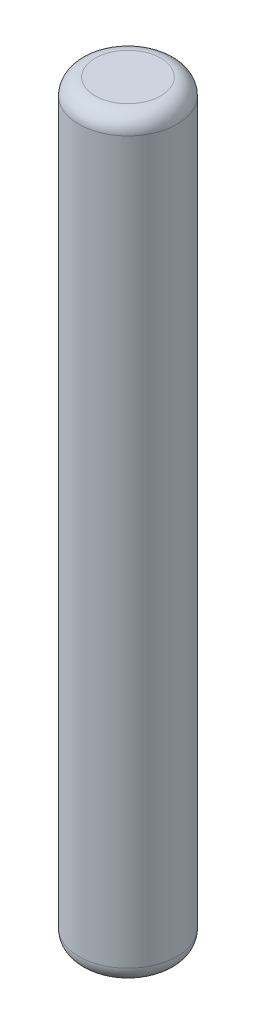
ISO-10303-21;
HEADER;
FILE_DESCRIPTION(('STEP AP214'),'2;1');
FILE_NAME('part.step','',(''),(''),'','','');
FILE_SCHEMA(('AUTOMOTIVE_DESIGN { 1 0 10303 214 1 1 1 1 }'));
ENDSEC;
DATA;
#1=APPLICATION_CONTEXT('core data for automotive mechanical design processes');
#2=APPLICATION_PROTOCOL_DEFINITION('international standard','automotive_design',2000,#1);
#3=PRODUCT_CONTEXT('',#1,'mechanical');
#4=PRODUCT('Part','Part','',(#3));
#5=PRODUCT_RELATED_PRODUCT_CATEGORY('part','',(#4));
#6=PRODUCT_DEFINITION_FORMATION('','',#4);
#7=PRODUCT_DEFINITION_CONTEXT('part definition',#1,'design');
#8=PRODUCT_DEFINITION('design','',#6,#7);
#9=PRODUCT_DEFINITION_SHAPE('','',#8);
#10=(LENGTH_UNIT() NAMED_UNIT(*) SI_UNIT(.MILLI.,.METRE.));
#11=(NAMED_UNIT(*) PLANE_ANGLE_UNIT() SI_UNIT($,.RADIAN.));
#12=(NAMED_UNIT(*) SI_UNIT($,.STERADIAN.) SOLID_ANGLE_UNIT());
#13=UNCERTAINTY_MEASURE_WITH_UNIT(LENGTH_MEASURE(1.E-05),#10,'distance_accuracy_value','');
#14=(GEOMETRIC_REPRESENTATION_CONTEXT(3) GLOBAL_UNCERTAINTY_ASSIGNED_CONTEXT((#13)) GLOBAL_UNIT_ASSIGNED_CONTEXT((#10,
#11,#12)) REPRESENTATION_CONTEXT('',''));
#15=CARTESIAN_POINT('',(0.,0.,0.));
#16=DIRECTION('',(0.,0.,1.));
#17=DIRECTION('',(1.,0.,0.));
#18=AXIS2_PLACEMENT_3D('',#15,#16,#17);
#19=CARTESIAN_POINT('',(0.,11.5,0.));
#20=DIRECTION('',(0.,-1.,0.));
#21=DIRECTION('',(0.,0.,-1.));
#22=AXIS2_PLACEMENT_3D('',#19,#20,#21);
#23=CYLINDRICAL_SURFACE('',#22,1.5);
#24=CARTESIAN_POINT('',(0.,-11.,0.));
#25=DIRECTION('',(0.,1.,0.));
#26=DIRECTION('',(0.,0.,1.));
#27=AXIS2_PLACEMENT_3D('',#24,#25,#26);
#28=CIRCLE('',#27,1.5);
#29=CARTESIAN_POINT('',(0.,-11.,1.5));
#30=VERTEX_POINT('',#29);
#31=EDGE_CURVE('E56',#30,#30,#28,.T.);
#32=ORIENTED_EDGE('',*,*,#31,.T.);
#33=EDGE_LOOP('',(#32));
#34=FACE_BOUND('',#33,.T.);
#35=CARTESIAN_POINT('',(0.,11.,0.));
#36=DIRECTION('',(0.,1.,0.));
#37=DIRECTION('',(0.,0.,1.));
#38=AXIS2_PLACEMENT_3D('',#35,#36,#37);
#39=CIRCLE('',#38,1.5);
#40=CARTESIAN_POINT('',(0.,11.,1.5));
#41=VERTEX_POINT('',#40);
#42=EDGE_CURVE('E60',#41,#41,#39,.F.);
#43=ORIENTED_EDGE('',*,*,#42,.T.);
#44=EDGE_LOOP('',(#43));
#45=FACE_BOUND('',#44,.T.);
#46=ADVANCED_FACE('F45',(#34,#45),#23,.T.);
#47=CARTESIAN_POINT('',(0.,11.5,0.));
#48=DIRECTION('',(0.,1.,0.));
#49=DIRECTION('',(0.,0.,1.));
#50=AXIS2_PLACEMENT_3D('',#47,#48,#49);
#51=PLANE('',#50);
#52=CARTESIAN_POINT('',(0.,11.5,0.));
#53=DIRECTION('',(0.,1.,0.));
#54=DIRECTION('',(0.,0.,1.));
#55=AXIS2_PLACEMENT_3D('',#52,#53,#54);
#56=CIRCLE('',#55,1.);
#57=CARTESIAN_POINT('',(0.,11.5,1.));
#58=VERTEX_POINT('',#57);
#59=EDGE_CURVE('E12',#58,#58,#56,.T.);
#60=ORIENTED_EDGE('',*,*,#59,.T.);
#61=EDGE_LOOP('',(#60));
#62=FACE_BOUND('',#61,.T.);
#63=ADVANCED_FACE('F76',(#62),#51,.T.);
#64=CARTESIAN_POINT('',(0.,-11.5,0.));
#65=DIRECTION('',(0.,1.,0.));
#66=DIRECTION('',(0.,0.,1.));
#67=AXIS2_PLACEMENT_3D('',#64,#65,#66);
#68=PLANE('',#67);
#69=CARTESIAN_POINT('',(0.,-11.5,0.));
#70=DIRECTION('',(0.,1.,0.));
#71=DIRECTION('',(0.,0.,1.));
#72=AXIS2_PLACEMENT_3D('',#69,#70,#71);
#73=CIRCLE('',#72,1.);
#74=CARTESIAN_POINT('',(0.,-11.5,1.));
#75=VERTEX_POINT('',#74);
#76=EDGE_CURVE('E52',#75,#75,#73,.F.);
#77=ORIENTED_EDGE('',*,*,#76,.T.);
#78=EDGE_LOOP('',(#77));
#79=FACE_BOUND('',#78,.T.);
#80=ADVANCED_FACE('F73',(#79),#68,.F.);
#81=CARTESIAN_POINT('',(0.,-11.,0.));
#82=DIRECTION('',(0.,1.,0.));
#83=DIRECTION('',(0.,0.,1.));
#84=AXIS2_PLACEMENT_3D('',#81,#82,#83);
#85=TOROIDAL_SURFACE('',#84,1.,0.5);
#86=ORIENTED_EDGE('',*,*,#76,.F.);
#87=EDGE_LOOP('',(#86));
#88=FACE_BOUND('',#87,.T.);
#89=ORIENTED_EDGE('',*,*,#31,.F.);
#90=EDGE_LOOP('',(#89));
#91=FACE_BOUND('',#90,.T.);
#92=ADVANCED_FACE('F69',(#88,#91),#85,.T.);
#93=CARTESIAN_POINT('',(0.,11.,0.));
#94=DIRECTION('',(0.,1.,0.));
#95=DIRECTION('',(0.,0.,1.));
#96=AXIS2_PLACEMENT_3D('',#93,#94,#95);
#97=TOROIDAL_SURFACE('',#96,1.,0.5);
#98=ORIENTED_EDGE('',*,*,#42,.F.);
#99=EDGE_LOOP('',(#98));
#100=FACE_BOUND('',#99,.T.);
#101=ORIENTED_EDGE('',*,*,#59,.F.);
#102=EDGE_LOOP('',(#101));
#103=FACE_BOUND('',#102,.T.);
#104=ADVANCED_FACE('F47',(#100,#103),#97,.T.);
#105=CLOSED_SHELL('',(#46,#63,#80,#92,#104));
#106=MANIFOLD_SOLID_BREP('B2',#105);
#107=ADVANCED_BREP_SHAPE_REPRESENTATION('',(#18,#106),#14);
#108=SHAPE_DEFINITION_REPRESENTATION(#9,#107);
ENDSEC;
END-ISO-10303-21;
